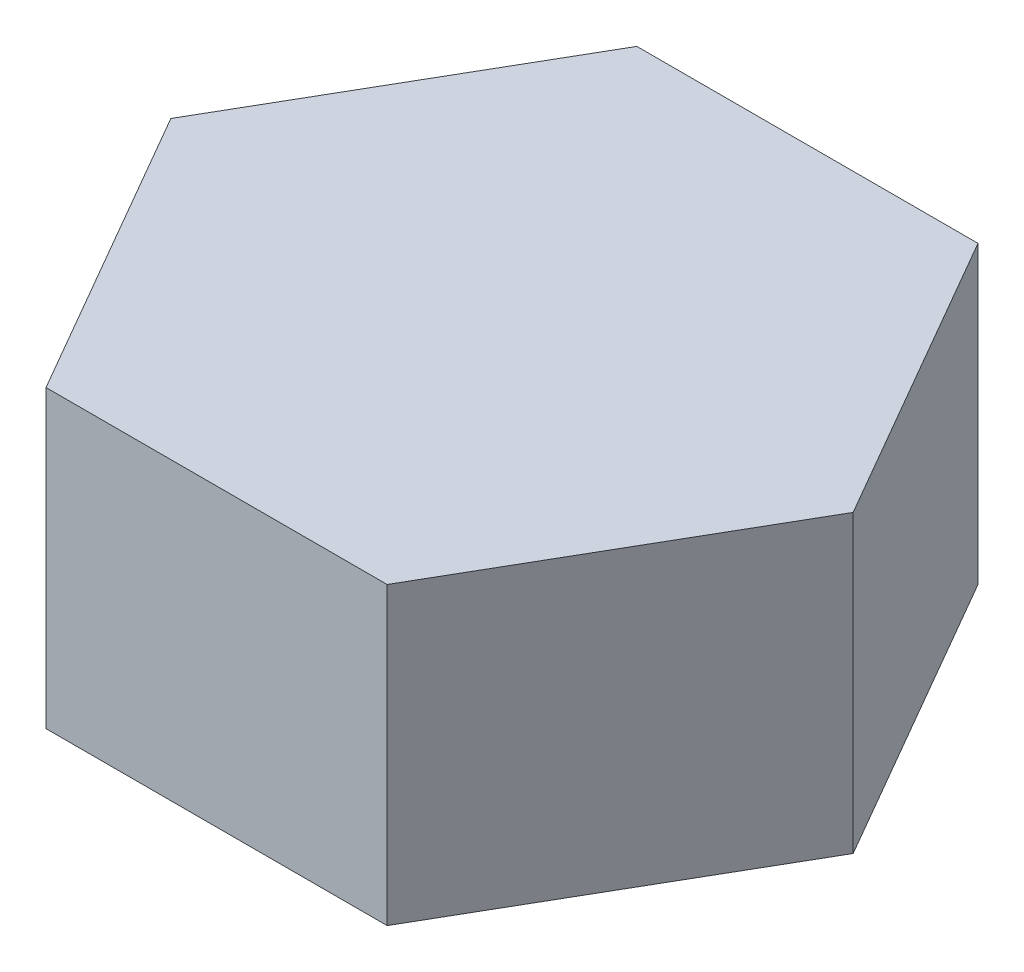
ISO-10303-21;
HEADER;
FILE_DESCRIPTION(('STEP AP214'),'2;1');
FILE_NAME('part.step','',(''),(''),'','','');
FILE_SCHEMA(('AUTOMOTIVE_DESIGN { 1 0 10303 214 1 1 1 1 }'));
ENDSEC;
DATA;
#1=APPLICATION_CONTEXT('core data for automotive mechanical design processes');
#2=APPLICATION_PROTOCOL_DEFINITION('international standard','automotive_design',2000,#1);
#3=PRODUCT_CONTEXT('',#1,'mechanical');
#4=PRODUCT('Part','Part','',(#3));
#5=PRODUCT_RELATED_PRODUCT_CATEGORY('part','',(#4));
#6=PRODUCT_DEFINITION_FORMATION('','',#4);
#7=PRODUCT_DEFINITION_CONTEXT('part definition',#1,'design');
#8=PRODUCT_DEFINITION('design','',#6,#7);
#9=PRODUCT_DEFINITION_SHAPE('','',#8);
#10=(LENGTH_UNIT() NAMED_UNIT(*) SI_UNIT(.MILLI.,.METRE.));
#11=(NAMED_UNIT(*) PLANE_ANGLE_UNIT() SI_UNIT($,.RADIAN.));
#12=(NAMED_UNIT(*) SI_UNIT($,.STERADIAN.) SOLID_ANGLE_UNIT());
#13=UNCERTAINTY_MEASURE_WITH_UNIT(LENGTH_MEASURE(1.E-05),#10,'distance_accuracy_value','');
#14=(GEOMETRIC_REPRESENTATION_CONTEXT(3) GLOBAL_UNCERTAINTY_ASSIGNED_CONTEXT((#13)) GLOBAL_UNIT_ASSIGNED_CONTEXT((#10,
#11,#12)) REPRESENTATION_CONTEXT('',''));
#15=CARTESIAN_POINT('',(0.,0.,0.));
#16=DIRECTION('',(0.,0.,1.));
#17=DIRECTION('',(1.,0.,0.));
#18=AXIS2_PLACEMENT_3D('',#15,#16,#17);
#19=CARTESIAN_POINT('',(0.,2.5,5.));
#20=DIRECTION('',(0.,0.,-1.));
#21=DIRECTION('',(-1.,0.,0.));
#22=AXIS2_PLACEMENT_3D('',#19,#20,#21);
#23=PLANE('',#22);
#24=DIRECTION('',(1.,0.,0.));
#25=VECTOR('',#24,1.);
#26=CARTESIAN_POINT('',(0.,-2.5,5.));
#27=LINE('',#26,#25);
#28=CARTESIAN_POINT('',(-2.88675134594813,-2.5,5.));
#29=VERTEX_POINT('',#28);
#30=CARTESIAN_POINT('',(2.88675134594813,-2.5,5.));
#31=VERTEX_POINT('',#30);
#32=EDGE_CURVE('E130',#29,#31,#27,.T.);
#33=ORIENTED_EDGE('',*,*,#32,.T.);
#34=DIRECTION('',(0.,-1.,0.));
#35=VECTOR('',#34,1.);
#36=CARTESIAN_POINT('',(2.88675134594813,2.5,5.));
#37=LINE('',#36,#35);
#38=CARTESIAN_POINT('',(2.88675134594813,2.5,5.));
#39=VERTEX_POINT('',#38);
#40=EDGE_CURVE('E11',#39,#31,#37,.T.);
#41=ORIENTED_EDGE('',*,*,#40,.F.);
#42=DIRECTION('',(1.,0.,0.));
#43=VECTOR('',#42,1.);
#44=CARTESIAN_POINT('',(0.,2.5,5.));
#45=LINE('',#44,#43);
#46=CARTESIAN_POINT('',(-2.88675134594813,2.5,5.));
#47=VERTEX_POINT('',#46);
#48=EDGE_CURVE('E146',#47,#39,#45,.T.);
#49=ORIENTED_EDGE('',*,*,#48,.F.);
#50=DIRECTION('',(0.,-1.,0.));
#51=VECTOR('',#50,1.);
#52=CARTESIAN_POINT('',(-2.88675134594813,2.5,5.));
#53=LINE('',#52,#51);
#54=EDGE_CURVE('E126',#47,#29,#53,.T.);
#55=ORIENTED_EDGE('',*,*,#54,.T.);
#56=EDGE_LOOP('',(#33,#41,#49,#55));
#57=FACE_BOUND('',#56,.T.);
#58=ADVANCED_FACE('F41',(#57),#23,.F.);
#59=CARTESIAN_POINT('',(4.33012701892219,2.5,2.5));
#60=DIRECTION('',(-0.866025403784439,0.,-0.5));
#61=DIRECTION('',(-0.5,0.,0.866025403784439));
#62=AXIS2_PLACEMENT_3D('',#59,#60,#61);
#63=PLANE('',#62);
#64=DIRECTION('',(0.5,0.,-0.866025403784439));
#65=VECTOR('',#64,1.);
#66=CARTESIAN_POINT('',(4.33012701892219,-2.5,2.5));
#67=LINE('',#66,#65);
#68=CARTESIAN_POINT('',(5.77350269189626,-2.5,0.));
#69=VERTEX_POINT('',#68);
#70=EDGE_CURVE('E134',#31,#69,#67,.T.);
#71=ORIENTED_EDGE('',*,*,#70,.T.);
#72=DIRECTION('',(0.,-1.,0.));
#73=VECTOR('',#72,1.);
#74=CARTESIAN_POINT('',(5.77350269189626,2.5,0.));
#75=LINE('',#74,#73);
#76=CARTESIAN_POINT('',(5.77350269189626,2.5,0.));
#77=VERTEX_POINT('',#76);
#78=EDGE_CURVE('E50',#77,#69,#75,.T.);
#79=ORIENTED_EDGE('',*,*,#78,.F.);
#80=DIRECTION('',(0.5,0.,-0.866025403784439));
#81=VECTOR('',#80,1.);
#82=CARTESIAN_POINT('',(4.33012701892219,2.5,2.5));
#83=LINE('',#82,#81);
#84=EDGE_CURVE('E95',#39,#77,#83,.T.);
#85=ORIENTED_EDGE('',*,*,#84,.F.);
#86=ORIENTED_EDGE('',*,*,#40,.T.);
#87=EDGE_LOOP('',(#71,#79,#85,#86));
#88=FACE_BOUND('',#87,.T.);
#89=ADVANCED_FACE('F174',(#88),#63,.F.);
#90=CARTESIAN_POINT('',(4.33012701892219,2.5,-2.5));
#91=DIRECTION('',(-0.866025403784438,0.,0.5));
#92=DIRECTION('',(0.5,0.,0.866025403784438));
#93=AXIS2_PLACEMENT_3D('',#90,#91,#92);
#94=PLANE('',#93);
#95=DIRECTION('',(-0.5,0.,-0.866025403784438));
#96=VECTOR('',#95,1.);
#97=CARTESIAN_POINT('',(4.33012701892219,-2.5,-2.5));
#98=LINE('',#97,#96);
#99=CARTESIAN_POINT('',(2.88675134594813,-2.5,-5.));
#100=VERTEX_POINT('',#99);
#101=EDGE_CURVE('E137',#69,#100,#98,.T.);
#102=ORIENTED_EDGE('',*,*,#101,.T.);
#103=DIRECTION('',(0.,-1.,0.));
#104=VECTOR('',#103,1.);
#105=CARTESIAN_POINT('',(2.88675134594813,2.5,-5.));
#106=LINE('',#105,#104);
#107=CARTESIAN_POINT('',(2.88675134594813,2.5,-5.));
#108=VERTEX_POINT('',#107);
#109=EDGE_CURVE('E119',#108,#100,#106,.T.);
#110=ORIENTED_EDGE('',*,*,#109,.F.);
#111=DIRECTION('',(-0.5,0.,-0.866025403784438));
#112=VECTOR('',#111,1.);
#113=CARTESIAN_POINT('',(4.33012701892219,2.5,-2.5));
#114=LINE('',#113,#112);
#115=EDGE_CURVE('E108',#77,#108,#114,.T.);
#116=ORIENTED_EDGE('',*,*,#115,.F.);
#117=ORIENTED_EDGE('',*,*,#78,.T.);
#118=EDGE_LOOP('',(#102,#110,#116,#117));
#119=FACE_BOUND('',#118,.T.);
#120=ADVANCED_FACE('F156',(#119),#94,.F.);
#121=CARTESIAN_POINT('',(0.,2.5,-5.));
#122=DIRECTION('',(0.,0.,1.));
#123=DIRECTION('',(1.,0.,0.));
#124=AXIS2_PLACEMENT_3D('',#121,#122,#123);
#125=PLANE('',#124);
#126=DIRECTION('',(-1.,0.,0.));
#127=VECTOR('',#126,1.);
#128=CARTESIAN_POINT('',(0.,-2.5,-5.));
#129=LINE('',#128,#127);
#130=CARTESIAN_POINT('',(-2.88675134594813,-2.5,-5.));
#131=VERTEX_POINT('',#130);
#132=EDGE_CURVE('E117',#100,#131,#129,.T.);
#133=ORIENTED_EDGE('',*,*,#132,.T.);
#134=DIRECTION('',(0.,-1.,0.));
#135=VECTOR('',#134,1.);
#136=CARTESIAN_POINT('',(-2.88675134594813,2.5,-5.));
#137=LINE('',#136,#135);
#138=CARTESIAN_POINT('',(-2.88675134594813,2.5,-5.));
#139=VERTEX_POINT('',#138);
#140=EDGE_CURVE('E114',#139,#131,#137,.T.);
#141=ORIENTED_EDGE('',*,*,#140,.F.);
#142=DIRECTION('',(-1.,0.,0.));
#143=VECTOR('',#142,1.);
#144=CARTESIAN_POINT('',(0.,2.5,-5.));
#145=LINE('',#144,#143);
#146=EDGE_CURVE('E102',#108,#139,#145,.T.);
#147=ORIENTED_EDGE('',*,*,#146,.F.);
#148=ORIENTED_EDGE('',*,*,#109,.T.);
#149=EDGE_LOOP('',(#133,#141,#147,#148));
#150=FACE_BOUND('',#149,.T.);
#151=ADVANCED_FACE('F115',(#150),#125,.F.);
#152=CARTESIAN_POINT('',(-4.3301270189222,2.5,-2.5));
#153=DIRECTION('',(0.866025403784438,0.,0.5));
#154=DIRECTION('',(0.5,0.,-0.866025403784439));
#155=AXIS2_PLACEMENT_3D('',#152,#153,#154);
#156=PLANE('',#155);
#157=DIRECTION('',(-0.5,0.,0.866025403784439));
#158=VECTOR('',#157,1.);
#159=CARTESIAN_POINT('',(-4.3301270189222,-2.5,-2.5));
#160=LINE('',#159,#158);
#161=CARTESIAN_POINT('',(-5.77350269189626,-2.5,0.));
#162=VERTEX_POINT('',#161);
#163=EDGE_CURVE('E81',#131,#162,#160,.T.);
#164=ORIENTED_EDGE('',*,*,#163,.T.);
#165=DIRECTION('',(0.,-1.,0.));
#166=VECTOR('',#165,1.);
#167=CARTESIAN_POINT('',(-5.77350269189626,2.5,0.));
#168=LINE('',#167,#166);
#169=CARTESIAN_POINT('',(-5.77350269189626,2.5,0.));
#170=VERTEX_POINT('',#169);
#171=EDGE_CURVE('E120',#170,#162,#168,.T.);
#172=ORIENTED_EDGE('',*,*,#171,.F.);
#173=DIRECTION('',(-0.5,0.,0.866025403784439));
#174=VECTOR('',#173,1.);
#175=CARTESIAN_POINT('',(-4.3301270189222,2.5,-2.5));
#176=LINE('',#175,#174);
#177=EDGE_CURVE('E106',#139,#170,#176,.T.);
#178=ORIENTED_EDGE('',*,*,#177,.F.);
#179=ORIENTED_EDGE('',*,*,#140,.T.);
#180=EDGE_LOOP('',(#164,#172,#178,#179));
#181=FACE_BOUND('',#180,.T.);
#182=ADVANCED_FACE('F122',(#181),#156,.F.);
#183=CARTESIAN_POINT('',(-4.33012701892219,2.5,2.5));
#184=DIRECTION('',(0.866025403784438,0.,-0.5));
#185=DIRECTION('',(-0.5,0.,-0.866025403784438));
#186=AXIS2_PLACEMENT_3D('',#183,#184,#185);
#187=PLANE('',#186);
#188=DIRECTION('',(0.5,0.,0.866025403784438));
#189=VECTOR('',#188,1.);
#190=CARTESIAN_POINT('',(-4.33012701892219,-2.5,2.5));
#191=LINE('',#190,#189);
#192=EDGE_CURVE('E87',#162,#29,#191,.T.);
#193=ORIENTED_EDGE('',*,*,#192,.T.);
#194=ORIENTED_EDGE('',*,*,#54,.F.);
#195=DIRECTION('',(0.5,0.,0.866025403784438));
#196=VECTOR('',#195,1.);
#197=CARTESIAN_POINT('',(-4.33012701892219,2.5,2.5));
#198=LINE('',#197,#196);
#199=EDGE_CURVE('E58',#170,#47,#198,.T.);
#200=ORIENTED_EDGE('',*,*,#199,.F.);
#201=ORIENTED_EDGE('',*,*,#171,.T.);
#202=EDGE_LOOP('',(#193,#194,#200,#201));
#203=FACE_BOUND('',#202,.T.);
#204=ADVANCED_FACE('F163',(#203),#187,.F.);
#205=CARTESIAN_POINT('',(0.,2.5,0.));
#206=DIRECTION('',(0.,1.,0.));
#207=DIRECTION('',(0.,0.,1.));
#208=AXIS2_PLACEMENT_3D('',#205,#206,#207);
#209=PLANE('',#208);
#210=ORIENTED_EDGE('',*,*,#48,.T.);
#211=ORIENTED_EDGE('',*,*,#84,.T.);
#212=ORIENTED_EDGE('',*,*,#115,.T.);
#213=ORIENTED_EDGE('',*,*,#146,.T.);
#214=ORIENTED_EDGE('',*,*,#177,.T.);
#215=ORIENTED_EDGE('',*,*,#199,.T.);
#216=EDGE_LOOP('',(#210,#211,#212,#213,#214,#215));
#217=FACE_BOUND('',#216,.T.);
#218=ADVANCED_FACE('F104',(#217),#209,.T.);
#219=CARTESIAN_POINT('',(0.,-2.5,0.));
#220=DIRECTION('',(0.,1.,0.));
#221=DIRECTION('',(0.,0.,1.));
#222=AXIS2_PLACEMENT_3D('',#219,#220,#221);
#223=PLANE('',#222);
#224=ORIENTED_EDGE('',*,*,#32,.F.);
#225=ORIENTED_EDGE('',*,*,#192,.F.);
#226=ORIENTED_EDGE('',*,*,#163,.F.);
#227=ORIENTED_EDGE('',*,*,#132,.F.);
#228=ORIENTED_EDGE('',*,*,#101,.F.);
#229=ORIENTED_EDGE('',*,*,#70,.F.);
#230=EDGE_LOOP('',(#224,#225,#226,#227,#228,#229));
#231=FACE_BOUND('',#230,.T.);
#232=ADVANCED_FACE('F159',(#231),#223,.F.);
#233=CLOSED_SHELL('',(#58,#89,#120,#151,#182,#204,#218,#232));
#234=MANIFOLD_SOLID_BREP('B2',#233);
#235=ADVANCED_BREP_SHAPE_REPRESENTATION('',(#18,#234),#14);
#236=SHAPE_DEFINITION_REPRESENTATION(#9,#235);
ENDSEC;
END-ISO-10303-21;
